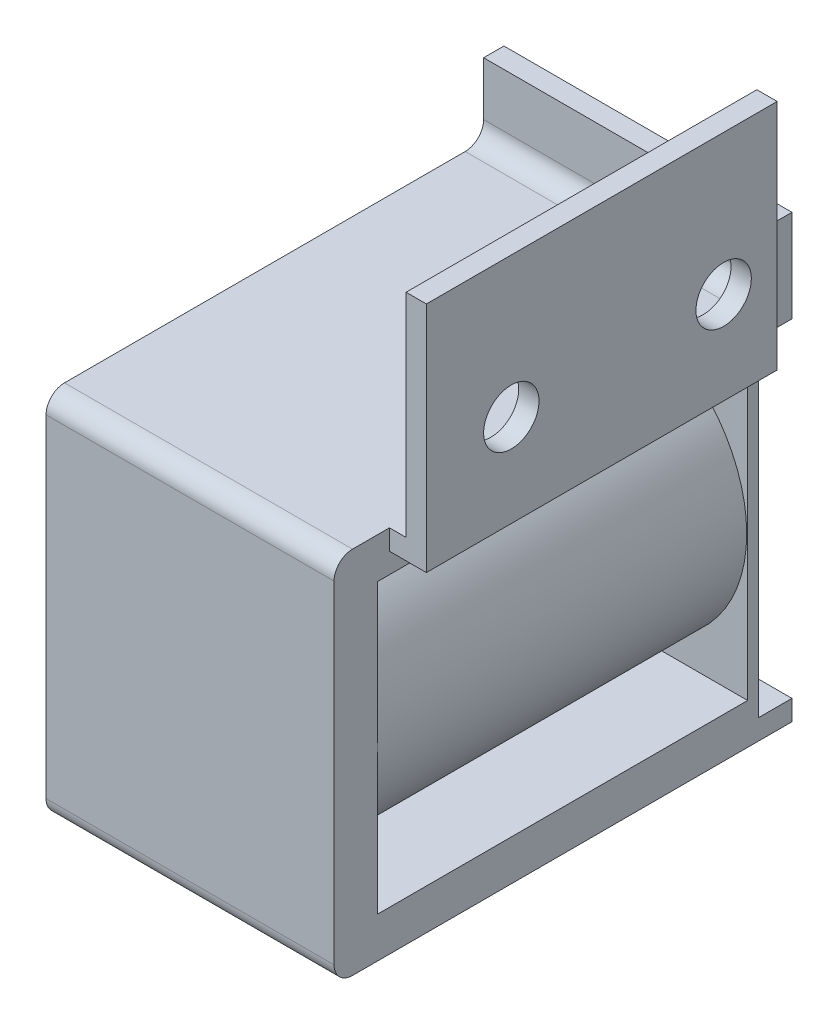
ISO-10303-21;
HEADER;
FILE_DESCRIPTION(('STEP AP214'),'2;1');
FILE_NAME('part.step','',(''),(''),'','','');
FILE_SCHEMA(('AUTOMOTIVE_DESIGN { 1 0 10303 214 1 1 1 1 }'));
ENDSEC;
DATA;
#1=APPLICATION_CONTEXT('core data for automotive mechanical design processes');
#2=APPLICATION_PROTOCOL_DEFINITION('international standard','automotive_design',2000,#1);
#3=PRODUCT_CONTEXT('',#1,'mechanical');
#4=PRODUCT('Part','Part','',(#3));
#5=PRODUCT_RELATED_PRODUCT_CATEGORY('part','',(#4));
#6=PRODUCT_DEFINITION_FORMATION('','',#4);
#7=PRODUCT_DEFINITION_CONTEXT('part definition',#1,'design');
#8=PRODUCT_DEFINITION('design','',#6,#7);
#9=PRODUCT_DEFINITION_SHAPE('','',#8);
#10=(LENGTH_UNIT() NAMED_UNIT(*) SI_UNIT(.MILLI.,.METRE.));
#11=(NAMED_UNIT(*) PLANE_ANGLE_UNIT() SI_UNIT($,.RADIAN.));
#12=(NAMED_UNIT(*) SI_UNIT($,.STERADIAN.) SOLID_ANGLE_UNIT());
#13=UNCERTAINTY_MEASURE_WITH_UNIT(LENGTH_MEASURE(1.E-05),#10,'distance_accuracy_value','');
#14=(GEOMETRIC_REPRESENTATION_CONTEXT(3) GLOBAL_UNCERTAINTY_ASSIGNED_CONTEXT((#13)) GLOBAL_UNIT_ASSIGNED_CONTEXT((#10,
#11,#12)) REPRESENTATION_CONTEXT('',''));
#15=CARTESIAN_POINT('',(0.,0.,0.));
#16=DIRECTION('',(0.,0.,1.));
#17=DIRECTION('',(1.,0.,0.));
#18=AXIS2_PLACEMENT_3D('',#15,#16,#17);
#19=CARTESIAN_POINT('',(0.,0.,0.));
#20=DIRECTION('',(0.,0.,1.));
#21=DIRECTION('',(1.,0.,0.));
#22=AXIS2_PLACEMENT_3D('',#19,#20,#21);
#23=PLANE('',#22);
#24=CARTESIAN_POINT('',(7.8,10.,0.));
#25=DIRECTION('',(0.,0.,1.));
#26=DIRECTION('',(0.,1.,0.));
#27=AXIS2_PLACEMENT_3D('',#24,#25,#26);
#28=CIRCLE('',#27,6.);
#29=CARTESIAN_POINT('',(7.8,16.,0.));
#30=VERTEX_POINT('',#29);
#31=EDGE_CURVE('E325',#30,#30,#28,.T.);
#32=ORIENTED_EDGE('',*,*,#31,.T.);
#33=EDGE_LOOP('',(#32));
#34=FACE_BOUND('',#33,.T.);
#35=DIRECTION('',(1.,0.,0.));
#36=VECTOR('',#35,1.);
#37=CARTESIAN_POINT('',(0.,1.1,0.));
#38=LINE('',#37,#36);
#39=CARTESIAN_POINT('',(0.,1.1,0.));
#40=VERTEX_POINT('',#39);
#41=CARTESIAN_POINT('',(15.6,1.1,0.));
#42=VERTEX_POINT('',#41);
#43=EDGE_CURVE('E222',#40,#42,#38,.T.);
#44=ORIENTED_EDGE('',*,*,#43,.F.);
#45=DIRECTION('',(0.,-1.,0.));
#46=VECTOR('',#45,1.);
#47=CARTESIAN_POINT('',(0.,20.,0.));
#48=LINE('',#47,#46);
#49=CARTESIAN_POINT('',(0.,18.9,0.));
#50=VERTEX_POINT('',#49);
#51=EDGE_CURVE('E340',#50,#40,#48,.T.);
#52=ORIENTED_EDGE('',*,*,#51,.F.);
#53=DIRECTION('',(1.,0.,0.));
#54=VECTOR('',#53,1.);
#55=CARTESIAN_POINT('',(-22.2101838133591,18.9,0.));
#56=LINE('',#55,#54);
#57=CARTESIAN_POINT('',(15.6,18.9,0.));
#58=VERTEX_POINT('',#57);
#59=EDGE_CURVE('E315',#50,#58,#56,.T.);
#60=ORIENTED_EDGE('',*,*,#59,.T.);
#61=DIRECTION('',(0.,1.,0.));
#62=VECTOR('',#61,1.);
#63=CARTESIAN_POINT('',(15.6,0.,0.));
#64=LINE('',#63,#62);
#65=EDGE_CURVE('E329',#42,#58,#64,.T.);
#66=ORIENTED_EDGE('',*,*,#65,.F.);
#67=EDGE_LOOP('',(#44,#52,#60,#66));
#68=FACE_BOUND('',#67,.T.);
#69=ADVANCED_FACE('F17',(#34,#68),#23,.F.);
#70=CARTESIAN_POINT('',(15.6,0.,23.));
#71=DIRECTION('',(-1.,0.,0.));
#72=DIRECTION('',(0.,0.,1.));
#73=AXIS2_PLACEMENT_3D('',#70,#71,#72);
#74=PLANE('',#73);
#75=DIRECTION('',(0.,0.,1.));
#76=VECTOR('',#75,1.);
#77=CARTESIAN_POINT('',(15.6,2.2,-21.8));
#78=LINE('',#77,#76);
#79=CARTESIAN_POINT('',(15.6,2.2,0.6));
#80=VERTEX_POINT('',#79);
#81=CARTESIAN_POINT('',(15.6,2.2,20.65));
#82=VERTEX_POINT('',#81);
#83=EDGE_CURVE('E206',#80,#82,#78,.T.);
#84=ORIENTED_EDGE('',*,*,#83,.T.);
#85=DIRECTION('',(0.,1.,0.));
#86=VECTOR('',#85,1.);
#87=CARTESIAN_POINT('',(15.6,2.2,20.65));
#88=LINE('',#87,#86);
#89=CARTESIAN_POINT('',(15.6,17.8,20.65));
#90=VERTEX_POINT('',#89);
#91=EDGE_CURVE('E196',#82,#90,#88,.T.);
#92=ORIENTED_EDGE('',*,*,#91,.T.);
#93=DIRECTION('',(0.,0.,1.));
#94=VECTOR('',#93,1.);
#95=CARTESIAN_POINT('',(15.6,17.8,-21.8));
#96=LINE('',#95,#94);
#97=CARTESIAN_POINT('',(15.6,17.8,0.6));
#98=VERTEX_POINT('',#97);
#99=EDGE_CURVE('E187',#98,#90,#96,.T.);
#100=ORIENTED_EDGE('',*,*,#99,.F.);
#101=DIRECTION('',(0.,-1.,0.));
#102=VECTOR('',#101,1.);
#103=CARTESIAN_POINT('',(15.6,2.2,0.6));
#104=LINE('',#103,#102);
#105=EDGE_CURVE('E172',#98,#80,#104,.T.);
#106=ORIENTED_EDGE('',*,*,#105,.T.);
#107=EDGE_LOOP('',(#84,#92,#100,#106));
#108=FACE_BOUND('',#107,.T.);
#109=DIRECTION('',(0.,1.,0.));
#110=VECTOR('',#109,1.);
#111=CARTESIAN_POINT('',(15.6,0.,23.));
#112=LINE('',#111,#110);
#113=CARTESIAN_POINT('',(15.6,1.,23.));
#114=VERTEX_POINT('',#113);
#115=CARTESIAN_POINT('',(15.6,19.,23.));
#116=VERTEX_POINT('',#115);
#117=EDGE_CURVE('E337',#114,#116,#112,.T.);
#118=ORIENTED_EDGE('',*,*,#117,.F.);
#119=CARTESIAN_POINT('',(15.6,1.,22.));
#120=DIRECTION('',(-1.,0.,0.));
#121=DIRECTION('',(0.,0.,1.));
#122=AXIS2_PLACEMENT_3D('',#119,#120,#121);
#123=CIRCLE('',#122,1.);
#124=CARTESIAN_POINT('',(15.6,0.,22.));
#125=VERTEX_POINT('',#124);
#126=EDGE_CURVE('E40',#114,#125,#123,.F.);
#127=ORIENTED_EDGE('',*,*,#126,.T.);
#128=DIRECTION('',(0.,0.,-1.));
#129=VECTOR('',#128,1.);
#130=CARTESIAN_POINT('',(15.6,0.,23.));
#131=LINE('',#130,#129);
#132=CARTESIAN_POINT('',(15.6,0.,-1.8));
#133=VERTEX_POINT('',#132);
#134=EDGE_CURVE('E336',#125,#133,#131,.T.);
#135=ORIENTED_EDGE('',*,*,#134,.T.);
#136=DIRECTION('',(0.,-1.,0.));
#137=VECTOR('',#136,1.);
#138=CARTESIAN_POINT('',(15.6,1.1,-1.8));
#139=LINE('',#138,#137);
#140=CARTESIAN_POINT('',(15.6,1.1,-1.8));
#141=VERTEX_POINT('',#140);
#142=EDGE_CURVE('E225',#141,#133,#139,.T.);
#143=ORIENTED_EDGE('',*,*,#142,.F.);
#144=DIRECTION('',(0.,0.,1.));
#145=VECTOR('',#144,1.);
#146=CARTESIAN_POINT('',(15.6,1.1,-1.8));
#147=LINE('',#146,#145);
#148=EDGE_CURVE('E232',#141,#42,#147,.T.);
#149=ORIENTED_EDGE('',*,*,#148,.T.);
#150=ORIENTED_EDGE('',*,*,#65,.T.);
#151=DIRECTION('',(0.,0.,1.));
#152=VECTOR('',#151,1.);
#153=CARTESIAN_POINT('',(15.6,18.9,0.));
#154=LINE('',#153,#152);
#155=CARTESIAN_POINT('',(15.6,18.9,-1.8));
#156=VERTEX_POINT('',#155);
#157=EDGE_CURVE('E312',#156,#58,#154,.T.);
#158=ORIENTED_EDGE('',*,*,#157,.F.);
#159=DIRECTION('',(0.,-1.,0.));
#160=VECTOR('',#159,1.);
#161=CARTESIAN_POINT('',(15.6,18.9,-1.8));
#162=LINE('',#161,#160);
#163=CARTESIAN_POINT('',(15.6,23.9,-1.8));
#164=VERTEX_POINT('',#163);
#165=EDGE_CURVE('E309',#164,#156,#162,.T.);
#166=ORIENTED_EDGE('',*,*,#165,.F.);
#167=DIRECTION('',(0.,0.,-1.));
#168=VECTOR('',#167,1.);
#169=CARTESIAN_POINT('',(15.6,23.9,-1.8));
#170=LINE('',#169,#168);
#171=CARTESIAN_POINT('',(15.6,23.9,-0.7));
#172=VERTEX_POINT('',#171);
#173=EDGE_CURVE('E306',#172,#164,#170,.T.);
#174=ORIENTED_EDGE('',*,*,#173,.F.);
#175=DIRECTION('',(0.,1.,0.));
#176=VECTOR('',#175,1.);
#177=CARTESIAN_POINT('',(15.6,23.9,-0.7));
#178=LINE('',#177,#176);
#179=CARTESIAN_POINT('',(15.6,21.,-0.7));
#180=VERTEX_POINT('',#179);
#181=EDGE_CURVE('E304',#180,#172,#178,.T.);
#182=ORIENTED_EDGE('',*,*,#181,.F.);
#183=CARTESIAN_POINT('',(15.6,21.,0.3));
#184=DIRECTION('',(-1.,0.,0.));
#185=DIRECTION('',(0.,0.,1.));
#186=AXIS2_PLACEMENT_3D('',#183,#184,#185);
#187=CIRCLE('',#186,1.);
#188=CARTESIAN_POINT('',(15.6,20.,0.3));
#189=VERTEX_POINT('',#188);
#190=EDGE_CURVE('E25',#180,#189,#187,.T.);
#191=ORIENTED_EDGE('',*,*,#190,.T.);
#192=DIRECTION('',(0.,0.,-1.));
#193=VECTOR('',#192,1.);
#194=CARTESIAN_POINT('',(15.6,20.,23.));
#195=LINE('',#194,#193);
#196=CARTESIAN_POINT('',(15.6,20.,1.));
#197=VERTEX_POINT('',#196);
#198=EDGE_CURVE('E352',#197,#189,#195,.T.);
#199=ORIENTED_EDGE('',*,*,#198,.F.);
#200=DIRECTION('',(0.,-1.,0.));
#201=VECTOR('',#200,1.);
#202=CARTESIAN_POINT('',(15.6,20.,1.));
#203=LINE('',#202,#201);
#204=CARTESIAN_POINT('',(15.6,18.9,1.));
#205=VERTEX_POINT('',#204);
#206=EDGE_CURVE('E263',#197,#205,#203,.T.);
#207=ORIENTED_EDGE('',*,*,#206,.T.);
#208=DIRECTION('',(0.,0.,1.));
#209=VECTOR('',#208,1.);
#210=CARTESIAN_POINT('',(15.6,18.9,1.));
#211=LINE('',#210,#209);
#212=CARTESIAN_POINT('',(15.6,18.9,20.));
#213=VERTEX_POINT('',#212);
#214=EDGE_CURVE('E274',#205,#213,#211,.T.);
#215=ORIENTED_EDGE('',*,*,#214,.T.);
#216=DIRECTION('',(0.,1.,0.));
#217=VECTOR('',#216,1.);
#218=CARTESIAN_POINT('',(15.6,18.9,20.));
#219=LINE('',#218,#217);
#220=CARTESIAN_POINT('',(15.6,20.,20.));
#221=VERTEX_POINT('',#220);
#222=EDGE_CURVE('E273',#213,#221,#219,.T.);
#223=ORIENTED_EDGE('',*,*,#222,.T.);
#224=CARTESIAN_POINT('',(15.6,20.,22.));
#225=VERTEX_POINT('',#224);
#226=EDGE_CURVE('E353',#225,#221,#195,.T.);
#227=ORIENTED_EDGE('',*,*,#226,.F.);
#228=CARTESIAN_POINT('',(15.6,19.,22.));
#229=DIRECTION('',(-1.,0.,0.));
#230=DIRECTION('',(0.,0.,1.));
#231=AXIS2_PLACEMENT_3D('',#228,#229,#230);
#232=CIRCLE('',#231,1.);
#233=EDGE_CURVE('E368',#225,#116,#232,.F.);
#234=ORIENTED_EDGE('',*,*,#233,.T.);
#235=EDGE_LOOP('',(#118,#127,#135,#143,#149,#150,#158,#166,#174,#182,#191,#199,#207,#215,#223,
#227,#234));
#236=FACE_BOUND('',#235,.T.);
#237=ADVANCED_FACE('F195',(#108,#236),#74,.F.);
#238=CARTESIAN_POINT('',(15.6,20.,23.));
#239=DIRECTION('',(0.,-1.,0.));
#240=DIRECTION('',(1.,0.,0.));
#241=AXIS2_PLACEMENT_3D('',#238,#239,#240);
#242=PLANE('',#241);
#243=ORIENTED_EDGE('',*,*,#198,.T.);
#244=DIRECTION('',(1.,0.,0.));
#245=VECTOR('',#244,1.);
#246=CARTESIAN_POINT('',(15.6,20.,0.3));
#247=LINE('',#246,#245);
#248=CARTESIAN_POINT('',(0.,20.,0.3));
#249=VERTEX_POINT('',#248);
#250=EDGE_CURVE('E360',#189,#249,#247,.F.);
#251=ORIENTED_EDGE('',*,*,#250,.T.);
#252=DIRECTION('',(0.,0.,-1.));
#253=VECTOR('',#252,1.);
#254=CARTESIAN_POINT('',(0.,20.,23.));
#255=LINE('',#254,#253);
#256=CARTESIAN_POINT('',(0.,20.,22.));
#257=VERTEX_POINT('',#256);
#258=EDGE_CURVE('E349',#257,#249,#255,.T.);
#259=ORIENTED_EDGE('',*,*,#258,.F.);
#260=DIRECTION('',(-1.,0.,0.));
#261=VECTOR('',#260,1.);
#262=CARTESIAN_POINT('',(15.6,20.,22.));
#263=LINE('',#262,#261);
#264=EDGE_CURVE('E358',#257,#225,#263,.F.);
#265=ORIENTED_EDGE('',*,*,#264,.T.);
#266=ORIENTED_EDGE('',*,*,#226,.T.);
#267=DIRECTION('',(-1.,0.,0.));
#268=VECTOR('',#267,1.);
#269=CARTESIAN_POINT('',(17.6,20.,20.));
#270=LINE('',#269,#268);
#271=CARTESIAN_POINT('',(16.5,20.,20.));
#272=VERTEX_POINT('',#271);
#273=EDGE_CURVE('E285',#272,#221,#270,.T.);
#274=ORIENTED_EDGE('',*,*,#273,.F.);
#275=DIRECTION('',(0.,0.,-1.));
#276=VECTOR('',#275,1.);
#277=CARTESIAN_POINT('',(16.5,20.,20.));
#278=LINE('',#277,#276);
#279=CARTESIAN_POINT('',(16.5,20.,1.));
#280=VERTEX_POINT('',#279);
#281=EDGE_CURVE('E243',#272,#280,#278,.T.);
#282=ORIENTED_EDGE('',*,*,#281,.T.);
#283=DIRECTION('',(-1.,0.,0.));
#284=VECTOR('',#283,1.);
#285=CARTESIAN_POINT('',(17.6,20.,1.));
#286=LINE('',#285,#284);
#287=EDGE_CURVE('E270',#280,#197,#286,.T.);
#288=ORIENTED_EDGE('',*,*,#287,.T.);
#289=EDGE_LOOP('',(#243,#251,#259,#265,#266,#274,#282,#288));
#290=FACE_BOUND('',#289,.T.);
#291=ADVANCED_FACE('F383',(#290),#242,.F.);
#292=CARTESIAN_POINT('',(0.,20.,23.));
#293=DIRECTION('',(1.,0.,0.));
#294=DIRECTION('',(0.,1.,0.));
#295=AXIS2_PLACEMENT_3D('',#292,#293,#294);
#296=PLANE('',#295);
#297=DIRECTION('',(0.,0.,1.));
#298=VECTOR('',#297,1.);
#299=CARTESIAN_POINT('',(0.,17.8,-21.8));
#300=LINE('',#299,#298);
#301=CARTESIAN_POINT('',(0.,17.8,0.6));
#302=VERTEX_POINT('',#301);
#303=CARTESIAN_POINT('',(0.,17.8,20.65));
#304=VERTEX_POINT('',#303);
#305=EDGE_CURVE('E190',#302,#304,#300,.T.);
#306=ORIENTED_EDGE('',*,*,#305,.T.);
#307=DIRECTION('',(0.,-1.,0.));
#308=VECTOR('',#307,1.);
#309=CARTESIAN_POINT('',(0.,17.8,20.65));
#310=LINE('',#309,#308);
#311=CARTESIAN_POINT('',(0.,2.2,20.65));
#312=VERTEX_POINT('',#311);
#313=EDGE_CURVE('E1189',#304,#312,#310,.T.);
#314=ORIENTED_EDGE('',*,*,#313,.T.);
#315=DIRECTION('',(0.,0.,1.));
#316=VECTOR('',#315,1.);
#317=CARTESIAN_POINT('',(0.,2.2,-21.8));
#318=LINE('',#317,#316);
#319=CARTESIAN_POINT('',(0.,2.2,0.6));
#320=VERTEX_POINT('',#319);
#321=EDGE_CURVE('E199',#320,#312,#318,.T.);
#322=ORIENTED_EDGE('',*,*,#321,.F.);
#323=DIRECTION('',(0.,1.,0.));
#324=VECTOR('',#323,1.);
#325=CARTESIAN_POINT('',(0.,17.8,0.6));
#326=LINE('',#325,#324);
#327=EDGE_CURVE('E1186',#320,#302,#326,.T.);
#328=ORIENTED_EDGE('',*,*,#327,.T.);
#329=EDGE_LOOP('',(#306,#314,#322,#328));
#330=FACE_BOUND('',#329,.T.);
#331=DIRECTION('',(0.,0.,-1.));
#332=VECTOR('',#331,1.);
#333=CARTESIAN_POINT('',(0.,0.,23.));
#334=LINE('',#333,#332);
#335=CARTESIAN_POINT('',(0.,0.,22.));
#336=VERTEX_POINT('',#335);
#337=CARTESIAN_POINT('',(0.,0.,-1.8));
#338=VERTEX_POINT('',#337);
#339=EDGE_CURVE('E347',#336,#338,#334,.T.);
#340=ORIENTED_EDGE('',*,*,#339,.F.);
#341=CARTESIAN_POINT('',(0.,1.,22.));
#342=DIRECTION('',(1.,0.,0.));
#343=DIRECTION('',(0.,1.,0.));
#344=AXIS2_PLACEMENT_3D('',#341,#342,#343);
#345=CIRCLE('',#344,1.);
#346=CARTESIAN_POINT('',(0.,1.,23.));
#347=VERTEX_POINT('',#346);
#348=EDGE_CURVE('E374',#336,#347,#345,.F.);
#349=ORIENTED_EDGE('',*,*,#348,.T.);
#350=DIRECTION('',(0.,-1.,0.));
#351=VECTOR('',#350,1.);
#352=CARTESIAN_POINT('',(0.,20.,23.));
#353=LINE('',#352,#351);
#354=CARTESIAN_POINT('',(0.,19.,23.));
#355=VERTEX_POINT('',#354);
#356=EDGE_CURVE('E333',#355,#347,#353,.T.);
#357=ORIENTED_EDGE('',*,*,#356,.F.);
#358=CARTESIAN_POINT('',(0.,19.,22.));
#359=DIRECTION('',(1.,0.,0.));
#360=DIRECTION('',(0.,1.,0.));
#361=AXIS2_PLACEMENT_3D('',#358,#359,#360);
#362=CIRCLE('',#361,1.);
#363=EDGE_CURVE('E372',#355,#257,#362,.F.);
#364=ORIENTED_EDGE('',*,*,#363,.T.);
#365=ORIENTED_EDGE('',*,*,#258,.T.);
#366=CARTESIAN_POINT('',(0.,21.,0.3));
#367=DIRECTION('',(1.,0.,0.));
#368=DIRECTION('',(0.,1.,0.));
#369=AXIS2_PLACEMENT_3D('',#366,#367,#368);
#370=CIRCLE('',#369,1.);
#371=CARTESIAN_POINT('',(0.,21.,-0.7));
#372=VERTEX_POINT('',#371);
#373=EDGE_CURVE('E11',#249,#372,#370,.T.);
#374=ORIENTED_EDGE('',*,*,#373,.T.);
#375=DIRECTION('',(0.,-1.,0.));
#376=VECTOR('',#375,1.);
#377=CARTESIAN_POINT('',(0.,23.9,-0.7));
#378=LINE('',#377,#376);
#379=CARTESIAN_POINT('',(0.,23.9,-0.7));
#380=VERTEX_POINT('',#379);
#381=EDGE_CURVE('E292',#380,#372,#378,.T.);
#382=ORIENTED_EDGE('',*,*,#381,.F.);
#383=DIRECTION('',(0.,0.,1.));
#384=VECTOR('',#383,1.);
#385=CARTESIAN_POINT('',(0.,23.9,-1.8));
#386=LINE('',#385,#384);
#387=CARTESIAN_POINT('',(0.,23.9,-1.8));
#388=VERTEX_POINT('',#387);
#389=EDGE_CURVE('E295',#388,#380,#386,.T.);
#390=ORIENTED_EDGE('',*,*,#389,.F.);
#391=DIRECTION('',(0.,1.,0.));
#392=VECTOR('',#391,1.);
#393=CARTESIAN_POINT('',(0.,18.9,-1.8));
#394=LINE('',#393,#392);
#395=CARTESIAN_POINT('',(0.,18.9,-1.8));
#396=VERTEX_POINT('',#395);
#397=EDGE_CURVE('E298',#396,#388,#394,.T.);
#398=ORIENTED_EDGE('',*,*,#397,.F.);
#399=DIRECTION('',(0.,0.,-1.));
#400=VECTOR('',#399,1.);
#401=CARTESIAN_POINT('',(0.,18.9,0.));
#402=LINE('',#401,#400);
#403=EDGE_CURVE('E301',#50,#396,#402,.T.);
#404=ORIENTED_EDGE('',*,*,#403,.F.);
#405=ORIENTED_EDGE('',*,*,#51,.T.);
#406=DIRECTION('',(0.,0.,1.));
#407=VECTOR('',#406,1.);
#408=CARTESIAN_POINT('',(0.,1.1,-1.8));
#409=LINE('',#408,#407);
#410=CARTESIAN_POINT('',(0.,1.1,-1.8));
#411=VERTEX_POINT('',#410);
#412=EDGE_CURVE('E240',#411,#40,#409,.T.);
#413=ORIENTED_EDGE('',*,*,#412,.F.);
#414=DIRECTION('',(0.,1.,0.));
#415=VECTOR('',#414,1.);
#416=CARTESIAN_POINT('',(0.,0.,-1.8));
#417=LINE('',#416,#415);
#418=EDGE_CURVE('E226',#338,#411,#417,.T.);
#419=ORIENTED_EDGE('',*,*,#418,.F.);
#420=EDGE_LOOP('',(#340,#349,#357,#364,#365,#374,#382,#390,#398,#404,#405,#413,#419));
#421=FACE_BOUND('',#420,.T.);
#422=ADVANCED_FACE('F390',(#330,#421),#296,.F.);
#423=CARTESIAN_POINT('',(0.,0.,23.));
#424=DIRECTION('',(0.,1.,0.));
#425=DIRECTION('',(0.,0.,1.));
#426=AXIS2_PLACEMENT_3D('',#423,#424,#425);
#427=PLANE('',#426);
#428=ORIENTED_EDGE('',*,*,#134,.F.);
#429=DIRECTION('',(1.,0.,0.));
#430=VECTOR('',#429,1.);
#431=CARTESIAN_POINT('',(0.,0.,22.));
#432=LINE('',#431,#430);
#433=EDGE_CURVE('E32',#125,#336,#432,.F.);
#434=ORIENTED_EDGE('',*,*,#433,.T.);
#435=ORIENTED_EDGE('',*,*,#339,.T.);
#436=DIRECTION('',(-1.,0.,0.));
#437=VECTOR('',#436,1.);
#438=CARTESIAN_POINT('',(15.6,0.,-1.8));
#439=LINE('',#438,#437);
#440=EDGE_CURVE('E229',#133,#338,#439,.T.);
#441=ORIENTED_EDGE('',*,*,#440,.F.);
#442=EDGE_LOOP('',(#428,#434,#435,#441));
#443=FACE_BOUND('',#442,.T.);
#444=ADVANCED_FACE('F472',(#443),#427,.F.);
#445=CARTESIAN_POINT('',(0.,0.,23.));
#446=DIRECTION('',(0.,0.,1.));
#447=DIRECTION('',(1.,0.,0.));
#448=AXIS2_PLACEMENT_3D('',#445,#446,#447);
#449=PLANE('',#448);
#450=ORIENTED_EDGE('',*,*,#356,.T.);
#451=DIRECTION('',(1.,0.,0.));
#452=VECTOR('',#451,1.);
#453=CARTESIAN_POINT('',(15.6,1.,23.));
#454=LINE('',#453,#452);
#455=EDGE_CURVE('E365',#347,#114,#454,.T.);
#456=ORIENTED_EDGE('',*,*,#455,.T.);
#457=ORIENTED_EDGE('',*,*,#117,.T.);
#458=DIRECTION('',(-1.,0.,0.));
#459=VECTOR('',#458,1.);
#460=CARTESIAN_POINT('',(0.,19.,23.));
#461=LINE('',#460,#459);
#462=EDGE_CURVE('E362',#116,#355,#461,.T.);
#463=ORIENTED_EDGE('',*,*,#462,.T.);
#464=EDGE_LOOP('',(#450,#456,#457,#463));
#465=FACE_BOUND('',#464,.T.);
#466=ADVANCED_FACE('F422',(#465),#449,.T.);
#467=CARTESIAN_POINT('',(7.8,10.,-1.7));
#468=DIRECTION('',(0.,0.,1.));
#469=DIRECTION('',(1.,0.,0.));
#470=AXIS2_PLACEMENT_3D('',#467,#468,#469);
#471=CYLINDRICAL_SURFACE('',#470,6.);
#472=CARTESIAN_POINT('',(7.8,10.,-1.7));
#473=DIRECTION('',(0.,0.,1.));
#474=DIRECTION('',(0.,1.,0.));
#475=AXIS2_PLACEMENT_3D('',#472,#473,#474);
#476=CIRCLE('',#475,6.);
#477=CARTESIAN_POINT('',(7.8,16.,-1.7));
#478=VERTEX_POINT('',#477);
#479=EDGE_CURVE('E326',#478,#478,#476,.T.);
#480=ORIENTED_EDGE('',*,*,#479,.T.);
#481=EDGE_LOOP('',(#480));
#482=FACE_BOUND('',#481,.T.);
#483=ORIENTED_EDGE('',*,*,#31,.F.);
#484=EDGE_LOOP('',(#483));
#485=FACE_BOUND('',#484,.T.);
#486=ADVANCED_FACE('F674',(#482,#485),#471,.T.);
#487=CARTESIAN_POINT('',(7.8,10.,-1.7));
#488=DIRECTION('',(0.,0.,1.));
#489=DIRECTION('',(1.,0.,0.));
#490=AXIS2_PLACEMENT_3D('',#487,#488,#489);
#491=PLANE('',#490);
#492=ORIENTED_EDGE('',*,*,#479,.F.);
#493=EDGE_LOOP('',(#492));
#494=FACE_BOUND('',#493,.T.);
#495=ADVANCED_FACE('F664',(#494),#491,.F.);
#496=CARTESIAN_POINT('',(-22.2101838133591,18.9,0.));
#497=DIRECTION('',(0.,-1.,0.));
#498=DIRECTION('',(0.,0.,-1.));
#499=AXIS2_PLACEMENT_3D('',#496,#497,#498);
#500=PLANE('',#499);
#501=ORIENTED_EDGE('',*,*,#59,.F.);
#502=ORIENTED_EDGE('',*,*,#403,.T.);
#503=DIRECTION('',(1.,0.,0.));
#504=VECTOR('',#503,1.);
#505=CARTESIAN_POINT('',(-22.2101838133591,18.9,-1.8));
#506=LINE('',#505,#504);
#507=EDGE_CURVE('E323',#396,#156,#506,.T.);
#508=ORIENTED_EDGE('',*,*,#507,.T.);
#509=ORIENTED_EDGE('',*,*,#157,.T.);
#510=EDGE_LOOP('',(#501,#502,#508,#509));
#511=FACE_BOUND('',#510,.T.);
#512=ADVANCED_FACE('F404',(#511),#500,.T.);
#513=CARTESIAN_POINT('',(-22.2101838133591,18.9,-1.8));
#514=DIRECTION('',(0.,0.,-1.));
#515=DIRECTION('',(-1.,0.,0.));
#516=AXIS2_PLACEMENT_3D('',#513,#514,#515);
#517=PLANE('',#516);
#518=ORIENTED_EDGE('',*,*,#507,.F.);
#519=ORIENTED_EDGE('',*,*,#397,.T.);
#520=DIRECTION('',(1.,0.,0.));
#521=VECTOR('',#520,1.);
#522=CARTESIAN_POINT('',(-22.2101838133591,23.9,-1.8));
#523=LINE('',#522,#521);
#524=EDGE_CURVE('E321',#388,#164,#523,.T.);
#525=ORIENTED_EDGE('',*,*,#524,.T.);
#526=ORIENTED_EDGE('',*,*,#165,.T.);
#527=EDGE_LOOP('',(#518,#519,#525,#526));
#528=FACE_BOUND('',#527,.T.);
#529=ADVANCED_FACE('F401',(#528),#517,.T.);
#530=CARTESIAN_POINT('',(-22.2101838133591,23.9,-1.8));
#531=DIRECTION('',(0.,1.,0.));
#532=DIRECTION('',(0.,0.,1.));
#533=AXIS2_PLACEMENT_3D('',#530,#531,#532);
#534=PLANE('',#533);
#535=ORIENTED_EDGE('',*,*,#524,.F.);
#536=ORIENTED_EDGE('',*,*,#389,.T.);
#537=DIRECTION('',(1.,0.,0.));
#538=VECTOR('',#537,1.);
#539=CARTESIAN_POINT('',(-22.2101838133591,23.9,-0.7));
#540=LINE('',#539,#538);
#541=EDGE_CURVE('E318',#380,#172,#540,.T.);
#542=ORIENTED_EDGE('',*,*,#541,.T.);
#543=ORIENTED_EDGE('',*,*,#173,.T.);
#544=EDGE_LOOP('',(#535,#536,#542,#543));
#545=FACE_BOUND('',#544,.T.);
#546=ADVANCED_FACE('F396',(#545),#534,.T.);
#547=CARTESIAN_POINT('',(-22.2101838133591,23.9,-0.7));
#548=DIRECTION('',(0.,0.,1.));
#549=DIRECTION('',(1.,0.,0.));
#550=AXIS2_PLACEMENT_3D('',#547,#548,#549);
#551=PLANE('',#550);
#552=ORIENTED_EDGE('',*,*,#381,.T.);
#553=DIRECTION('',(1.,0.,0.));
#554=VECTOR('',#553,1.);
#555=CARTESIAN_POINT('',(-22.2101838133591,21.,-0.7));
#556=LINE('',#555,#554);
#557=EDGE_CURVE('E355',#372,#180,#556,.T.);
#558=ORIENTED_EDGE('',*,*,#557,.T.);
#559=ORIENTED_EDGE('',*,*,#181,.T.);
#560=ORIENTED_EDGE('',*,*,#541,.F.);
#561=EDGE_LOOP('',(#552,#558,#559,#560));
#562=FACE_BOUND('',#561,.T.);
#563=ADVANCED_FACE('F393',(#562),#551,.T.);
#564=CARTESIAN_POINT('',(17.6,20.,1.));
#565=DIRECTION('',(0.,0.,-1.));
#566=DIRECTION('',(0.,1.,0.));
#567=AXIS2_PLACEMENT_3D('',#564,#565,#566);
#568=PLANE('',#567);
#569=ORIENTED_EDGE('',*,*,#206,.F.);
#570=ORIENTED_EDGE('',*,*,#287,.F.);
#571=DIRECTION('',(0.,-1.,0.));
#572=VECTOR('',#571,1.);
#573=CARTESIAN_POINT('',(16.5,31.5,1.));
#574=LINE('',#573,#572);
#575=CARTESIAN_POINT('',(16.5,31.5,1.));
#576=VERTEX_POINT('',#575);
#577=EDGE_CURVE('E254',#576,#280,#574,.T.);
#578=ORIENTED_EDGE('',*,*,#577,.F.);
#579=DIRECTION('',(1.,0.,0.));
#580=VECTOR('',#579,1.);
#581=CARTESIAN_POINT('',(16.5,31.5,1.));
#582=LINE('',#581,#580);
#583=CARTESIAN_POINT('',(17.6,31.5,1.));
#584=VERTEX_POINT('',#583);
#585=EDGE_CURVE('E247',#576,#584,#582,.T.);
#586=ORIENTED_EDGE('',*,*,#585,.T.);
#587=DIRECTION('',(0.,-1.,0.));
#588=VECTOR('',#587,1.);
#589=CARTESIAN_POINT('',(17.6,20.,1.));
#590=LINE('',#589,#588);
#591=CARTESIAN_POINT('',(17.6,18.9,1.));
#592=VERTEX_POINT('',#591);
#593=EDGE_CURVE('E268',#584,#592,#590,.T.);
#594=ORIENTED_EDGE('',*,*,#593,.T.);
#595=DIRECTION('',(-1.,0.,0.));
#596=VECTOR('',#595,1.);
#597=CARTESIAN_POINT('',(17.6,18.9,1.));
#598=LINE('',#597,#596);
#599=EDGE_CURVE('E290',#592,#205,#598,.T.);
#600=ORIENTED_EDGE('',*,*,#599,.T.);
#601=EDGE_LOOP('',(#569,#570,#578,#586,#594,#600));
#602=FACE_BOUND('',#601,.T.);
#603=ADVANCED_FACE('F449',(#602),#568,.T.);
#604=CARTESIAN_POINT('',(17.6,18.9,1.));
#605=DIRECTION('',(0.,-1.,0.));
#606=DIRECTION('',(0.,0.,-1.));
#607=AXIS2_PLACEMENT_3D('',#604,#605,#606);
#608=PLANE('',#607);
#609=ORIENTED_EDGE('',*,*,#214,.F.);
#610=ORIENTED_EDGE('',*,*,#599,.F.);
#611=DIRECTION('',(0.,0.,1.));
#612=VECTOR('',#611,1.);
#613=CARTESIAN_POINT('',(17.6,18.9,1.));
#614=LINE('',#613,#612);
#615=CARTESIAN_POINT('',(17.6,18.9,20.));
#616=VERTEX_POINT('',#615);
#617=EDGE_CURVE('E264',#592,#616,#614,.T.);
#618=ORIENTED_EDGE('',*,*,#617,.T.);
#619=DIRECTION('',(-1.,0.,0.));
#620=VECTOR('',#619,1.);
#621=CARTESIAN_POINT('',(17.6,18.9,20.));
#622=LINE('',#621,#620);
#623=EDGE_CURVE('E288',#616,#213,#622,.T.);
#624=ORIENTED_EDGE('',*,*,#623,.T.);
#625=EDGE_LOOP('',(#609,#610,#618,#624));
#626=FACE_BOUND('',#625,.T.);
#627=ADVANCED_FACE('F435',(#626),#608,.T.);
#628=CARTESIAN_POINT('',(17.6,18.9,20.));
#629=DIRECTION('',(0.,0.,1.));
#630=DIRECTION('',(1.,0.,0.));
#631=AXIS2_PLACEMENT_3D('',#628,#629,#630);
#632=PLANE('',#631);
#633=ORIENTED_EDGE('',*,*,#222,.F.);
#634=ORIENTED_EDGE('',*,*,#623,.F.);
#635=DIRECTION('',(0.,1.,0.));
#636=VECTOR('',#635,1.);
#637=CARTESIAN_POINT('',(17.6,18.9,20.));
#638=LINE('',#637,#636);
#639=CARTESIAN_POINT('',(17.6,31.5,20.));
#640=VERTEX_POINT('',#639);
#641=EDGE_CURVE('E267',#616,#640,#638,.T.);
#642=ORIENTED_EDGE('',*,*,#641,.T.);
#643=DIRECTION('',(-1.,0.,0.));
#644=VECTOR('',#643,1.);
#645=CARTESIAN_POINT('',(17.6,31.5,20.));
#646=LINE('',#645,#644);
#647=CARTESIAN_POINT('',(16.5,31.5,20.));
#648=VERTEX_POINT('',#647);
#649=EDGE_CURVE('E248',#640,#648,#646,.T.);
#650=ORIENTED_EDGE('',*,*,#649,.T.);
#651=DIRECTION('',(0.,-1.,0.));
#652=VECTOR('',#651,1.);
#653=CARTESIAN_POINT('',(16.5,31.5,20.));
#654=LINE('',#653,#652);
#655=EDGE_CURVE('E261',#648,#272,#654,.T.);
#656=ORIENTED_EDGE('',*,*,#655,.T.);
#657=ORIENTED_EDGE('',*,*,#273,.T.);
#658=EDGE_LOOP('',(#633,#634,#642,#650,#656,#657));
#659=FACE_BOUND('',#658,.T.);
#660=ADVANCED_FACE('F431',(#659),#632,.T.);
#661=CARTESIAN_POINT('',(17.6,0.,0.));
#662=DIRECTION('',(-1.,0.,0.));
#663=DIRECTION('',(0.,0.,1.));
#664=AXIS2_PLACEMENT_3D('',#661,#662,#663);
#665=PLANE('',#664);
#666=CARTESIAN_POINT('',(17.6,23.9,3.9));
#667=DIRECTION('',(-1.,0.,0.));
#668=DIRECTION('',(0.,1.,0.));
#669=AXIS2_PLACEMENT_3D('',#666,#667,#668);
#670=CIRCLE('',#669,1.5);
#671=CARTESIAN_POINT('',(17.6,25.4,3.9));
#672=VERTEX_POINT('',#671);
#673=EDGE_CURVE('E191',#672,#672,#670,.T.);
#674=ORIENTED_EDGE('',*,*,#673,.T.);
#675=EDGE_LOOP('',(#674));
#676=FACE_BOUND('',#675,.T.);
#677=CARTESIAN_POINT('',(17.6,23.9,15.4));
#678=DIRECTION('',(-1.,0.,0.));
#679=DIRECTION('',(0.,1.,0.));
#680=AXIS2_PLACEMENT_3D('',#677,#678,#679);
#681=CIRCLE('',#680,1.5);
#682=CARTESIAN_POINT('',(17.6,25.4,15.4));
#683=VERTEX_POINT('',#682);
#684=EDGE_CURVE('E215',#683,#683,#681,.T.);
#685=ORIENTED_EDGE('',*,*,#684,.T.);
#686=EDGE_LOOP('',(#685));
#687=FACE_BOUND('',#686,.T.);
#688=ORIENTED_EDGE('',*,*,#593,.F.);
#689=DIRECTION('',(0.,0.,1.));
#690=VECTOR('',#689,1.);
#691=CARTESIAN_POINT('',(17.6,31.5,1.));
#692=LINE('',#691,#690);
#693=EDGE_CURVE('E251',#584,#640,#692,.T.);
#694=ORIENTED_EDGE('',*,*,#693,.T.);
#695=ORIENTED_EDGE('',*,*,#641,.F.);
#696=ORIENTED_EDGE('',*,*,#617,.F.);
#697=EDGE_LOOP('',(#688,#694,#695,#696));
#698=FACE_BOUND('',#697,.T.);
#699=ADVANCED_FACE('F441',(#676,#687,#698),#665,.F.);
#700=CARTESIAN_POINT('',(16.5,31.5,20.));
#701=DIRECTION('',(-1.,0.,0.));
#702=DIRECTION('',(0.,-1.,0.));
#703=AXIS2_PLACEMENT_3D('',#700,#701,#702);
#704=PLANE('',#703);
#705=CARTESIAN_POINT('',(16.5,23.9,3.9));
#706=DIRECTION('',(-1.,0.,0.));
#707=DIRECTION('',(0.,-1.,0.));
#708=AXIS2_PLACEMENT_3D('',#705,#706,#707);
#709=CIRCLE('',#708,1.5);
#710=CARTESIAN_POINT('',(16.5,22.4,3.9));
#711=VERTEX_POINT('',#710);
#712=EDGE_CURVE('E212',#711,#711,#709,.F.);
#713=ORIENTED_EDGE('',*,*,#712,.T.);
#714=EDGE_LOOP('',(#713));
#715=FACE_BOUND('',#714,.T.);
#716=CARTESIAN_POINT('',(16.5,23.9,15.4));
#717=DIRECTION('',(-1.,0.,0.));
#718=DIRECTION('',(0.,-1.,0.));
#719=AXIS2_PLACEMENT_3D('',#716,#717,#718);
#720=CIRCLE('',#719,1.5);
#721=CARTESIAN_POINT('',(16.5,22.4,15.4));
#722=VERTEX_POINT('',#721);
#723=EDGE_CURVE('E219',#722,#722,#720,.F.);
#724=ORIENTED_EDGE('',*,*,#723,.T.);
#725=EDGE_LOOP('',(#724));
#726=FACE_BOUND('',#725,.T.);
#727=ORIENTED_EDGE('',*,*,#281,.F.);
#728=ORIENTED_EDGE('',*,*,#655,.F.);
#729=DIRECTION('',(0.,0.,-1.));
#730=VECTOR('',#729,1.);
#731=CARTESIAN_POINT('',(16.5,31.5,20.));
#732=LINE('',#731,#730);
#733=EDGE_CURVE('E244',#648,#576,#732,.T.);
#734=ORIENTED_EDGE('',*,*,#733,.T.);
#735=ORIENTED_EDGE('',*,*,#577,.T.);
#736=EDGE_LOOP('',(#727,#728,#734,#735));
#737=FACE_BOUND('',#736,.T.);
#738=ADVANCED_FACE('F447',(#715,#726,#737),#704,.T.);
#739=CARTESIAN_POINT('',(0.,31.5,0.));
#740=DIRECTION('',(0.,-1.,0.));
#741=DIRECTION('',(1.,0.,0.));
#742=AXIS2_PLACEMENT_3D('',#739,#740,#741);
#743=PLANE('',#742);
#744=ORIENTED_EDGE('',*,*,#649,.F.);
#745=ORIENTED_EDGE('',*,*,#693,.F.);
#746=ORIENTED_EDGE('',*,*,#585,.F.);
#747=ORIENTED_EDGE('',*,*,#733,.F.);
#748=EDGE_LOOP('',(#744,#745,#746,#747));
#749=FACE_BOUND('',#748,.T.);
#750=ADVANCED_FACE('F445',(#749),#743,.F.);
#751=CARTESIAN_POINT('',(0.,1.1,-1.8));
#752=DIRECTION('',(0.,-1.,0.));
#753=DIRECTION('',(0.,0.,-1.));
#754=AXIS2_PLACEMENT_3D('',#751,#752,#753);
#755=PLANE('',#754);
#756=ORIENTED_EDGE('',*,*,#43,.T.);
#757=ORIENTED_EDGE('',*,*,#148,.F.);
#758=DIRECTION('',(1.,0.,0.));
#759=VECTOR('',#758,1.);
#760=CARTESIAN_POINT('',(0.,1.1,-1.8));
#761=LINE('',#760,#759);
#762=EDGE_CURVE('E223',#411,#141,#761,.T.);
#763=ORIENTED_EDGE('',*,*,#762,.F.);
#764=ORIENTED_EDGE('',*,*,#412,.T.);
#765=EDGE_LOOP('',(#756,#757,#763,#764));
#766=FACE_BOUND('',#765,.T.);
#767=ADVANCED_FACE('F410',(#766),#755,.F.);
#768=CARTESIAN_POINT('',(0.,0.,-1.8));
#769=DIRECTION('',(0.,0.,-1.));
#770=DIRECTION('',(-1.,0.,0.));
#771=AXIS2_PLACEMENT_3D('',#768,#769,#770);
#772=PLANE('',#771);
#773=ORIENTED_EDGE('',*,*,#418,.T.);
#774=ORIENTED_EDGE('',*,*,#762,.T.);
#775=ORIENTED_EDGE('',*,*,#142,.T.);
#776=ORIENTED_EDGE('',*,*,#440,.T.);
#777=EDGE_LOOP('',(#773,#774,#775,#776));
#778=FACE_BOUND('',#777,.T.);
#779=ADVANCED_FACE('F414',(#778),#772,.T.);
#780=CARTESIAN_POINT('',(-26.1841295448477,23.9,15.4));
#781=DIRECTION('',(1.,0.,0.));
#782=DIRECTION('',(0.,0.,-1.));
#783=AXIS2_PLACEMENT_3D('',#780,#781,#782);
#784=CYLINDRICAL_SURFACE('',#783,1.5);
#785=ORIENTED_EDGE('',*,*,#684,.F.);
#786=EDGE_LOOP('',(#785));
#787=FACE_BOUND('',#786,.T.);
#788=ORIENTED_EDGE('',*,*,#723,.F.);
#789=EDGE_LOOP('',(#788));
#790=FACE_BOUND('',#789,.T.);
#791=ADVANCED_FACE('F569',(#787,#790),#784,.F.);
#792=CARTESIAN_POINT('',(-26.1841295448477,23.9,3.9));
#793=DIRECTION('',(1.,0.,0.));
#794=DIRECTION('',(0.,0.,-1.));
#795=AXIS2_PLACEMENT_3D('',#792,#793,#794);
#796=CYLINDRICAL_SURFACE('',#795,1.5);
#797=ORIENTED_EDGE('',*,*,#673,.F.);
#798=EDGE_LOOP('',(#797));
#799=FACE_BOUND('',#798,.T.);
#800=ORIENTED_EDGE('',*,*,#712,.F.);
#801=EDGE_LOOP('',(#800));
#802=FACE_BOUND('',#801,.T.);
#803=ADVANCED_FACE('F557',(#799,#802),#796,.F.);
#804=CARTESIAN_POINT('',(15.6,2.2,-21.8));
#805=DIRECTION('',(0.,1.,0.));
#806=DIRECTION('',(-1.,0.,0.));
#807=AXIS2_PLACEMENT_3D('',#804,#805,#806);
#808=PLANE('',#807);
#809=DIRECTION('',(-1.,0.,0.));
#810=VECTOR('',#809,1.);
#811=CARTESIAN_POINT('',(15.6,2.2,0.6));
#812=LINE('',#811,#810);
#813=EDGE_CURVE('E178',#80,#320,#812,.T.);
#814=ORIENTED_EDGE('',*,*,#813,.T.);
#815=ORIENTED_EDGE('',*,*,#321,.T.);
#816=DIRECTION('',(1.,0.,0.));
#817=VECTOR('',#816,1.);
#818=CARTESIAN_POINT('',(15.6,2.2,20.65));
#819=LINE('',#818,#817);
#820=EDGE_CURVE('E1191',#312,#82,#819,.T.);
#821=ORIENTED_EDGE('',*,*,#820,.T.);
#822=ORIENTED_EDGE('',*,*,#83,.F.);
#823=EDGE_LOOP('',(#814,#815,#821,#822));
#824=FACE_BOUND('',#823,.T.);
#825=ADVANCED_FACE('F545',(#824),#808,.T.);
#826=CARTESIAN_POINT('',(7.8,10.,-21.8));
#827=DIRECTION('',(0.,0.,1.));
#828=DIRECTION('',(1.,0.,0.));
#829=AXIS2_PLACEMENT_3D('',#826,#827,#828);
#830=CYLINDRICAL_SURFACE('',#829,7.75);
#831=CARTESIAN_POINT('',(7.8,10.,20.65));
#832=DIRECTION('',(0.,0.,1.));
#833=DIRECTION('',(1.,0.,0.));
#834=AXIS2_PLACEMENT_3D('',#831,#832,#833);
#835=CIRCLE('',#834,7.75);
#836=CARTESIAN_POINT('',(15.55,10.,20.65));
#837=VERTEX_POINT('',#836);
#838=EDGE_CURVE('E197',#837,#837,#835,.T.);
#839=ORIENTED_EDGE('',*,*,#838,.F.);
#840=EDGE_LOOP('',(#839));
#841=FACE_BOUND('',#840,.T.);
#842=CARTESIAN_POINT('',(7.8,10.,0.6));
#843=DIRECTION('',(0.,0.,-1.));
#844=DIRECTION('',(-1.,0.,0.));
#845=AXIS2_PLACEMENT_3D('',#842,#843,#844);
#846=CIRCLE('',#845,7.75);
#847=CARTESIAN_POINT('',(0.0499999999999997,10.,0.6));
#848=VERTEX_POINT('',#847);
#849=EDGE_CURVE('E182',#848,#848,#846,.T.);
#850=ORIENTED_EDGE('',*,*,#849,.F.);
#851=EDGE_LOOP('',(#850));
#852=FACE_BOUND('',#851,.T.);
#853=ADVANCED_FACE('F533',(#841,#852),#830,.T.);
#854=CARTESIAN_POINT('',(15.6,17.8,-21.8));
#855=DIRECTION('',(0.,-1.,0.));
#856=DIRECTION('',(1.,0.,0.));
#857=AXIS2_PLACEMENT_3D('',#854,#855,#856);
#858=PLANE('',#857);
#859=DIRECTION('',(1.,0.,0.));
#860=VECTOR('',#859,1.);
#861=CARTESIAN_POINT('',(15.6,17.8,0.6));
#862=LINE('',#861,#860);
#863=EDGE_CURVE('E175',#302,#98,#862,.T.);
#864=ORIENTED_EDGE('',*,*,#863,.T.);
#865=ORIENTED_EDGE('',*,*,#99,.T.);
#866=DIRECTION('',(-1.,0.,0.));
#867=VECTOR('',#866,1.);
#868=CARTESIAN_POINT('',(15.6,17.8,20.65));
#869=LINE('',#868,#867);
#870=EDGE_CURVE('E192',#90,#304,#869,.T.);
#871=ORIENTED_EDGE('',*,*,#870,.T.);
#872=ORIENTED_EDGE('',*,*,#305,.F.);
#873=EDGE_LOOP('',(#864,#865,#871,#872));
#874=FACE_BOUND('',#873,.T.);
#875=ADVANCED_FACE('F185',(#874),#858,.T.);
#876=CARTESIAN_POINT('',(7.8,10.,20.65));
#877=DIRECTION('',(0.,0.,1.));
#878=DIRECTION('',(1.,0.,0.));
#879=AXIS2_PLACEMENT_3D('',#876,#877,#878);
#880=PLANE('',#879);
#881=ORIENTED_EDGE('',*,*,#838,.T.);
#882=EDGE_LOOP('',(#881));
#883=FACE_BOUND('',#882,.T.);
#884=ORIENTED_EDGE('',*,*,#820,.F.);
#885=ORIENTED_EDGE('',*,*,#313,.F.);
#886=ORIENTED_EDGE('',*,*,#870,.F.);
#887=ORIENTED_EDGE('',*,*,#91,.F.);
#888=EDGE_LOOP('',(#884,#885,#886,#887));
#889=FACE_BOUND('',#888,.T.);
#890=ADVANCED_FACE('F508',(#883,#889),#880,.F.);
#891=CARTESIAN_POINT('',(7.8,10.,0.6));
#892=DIRECTION('',(0.,0.,-1.));
#893=DIRECTION('',(0.,1.,0.));
#894=AXIS2_PLACEMENT_3D('',#891,#892,#893);
#895=PLANE('',#894);
#896=ORIENTED_EDGE('',*,*,#849,.T.);
#897=EDGE_LOOP('',(#896));
#898=FACE_BOUND('',#897,.T.);
#899=ORIENTED_EDGE('',*,*,#863,.F.);
#900=ORIENTED_EDGE('',*,*,#327,.F.);
#901=ORIENTED_EDGE('',*,*,#813,.F.);
#902=ORIENTED_EDGE('',*,*,#105,.F.);
#903=EDGE_LOOP('',(#899,#900,#901,#902));
#904=FACE_BOUND('',#903,.T.);
#905=ADVANCED_FACE('F174',(#898,#904),#895,.F.);
#906=CARTESIAN_POINT('',(-22.2101838133591,21.,0.3));
#907=DIRECTION('',(1.,0.,0.));
#908=DIRECTION('',(0.,1.,0.));
#909=AXIS2_PLACEMENT_3D('',#906,#907,#908);
#910=CYLINDRICAL_SURFACE('',#909,1.);
#911=ORIENTED_EDGE('',*,*,#373,.F.);
#912=ORIENTED_EDGE('',*,*,#250,.F.);
#913=ORIENTED_EDGE('',*,*,#190,.F.);
#914=ORIENTED_EDGE('',*,*,#557,.F.);
#915=EDGE_LOOP('',(#911,#912,#913,#914));
#916=FACE_BOUND('',#915,.T.);
#917=ADVANCED_FACE('F388',(#916),#910,.F.);
#918=CARTESIAN_POINT('',(0.,1.,22.));
#919=DIRECTION('',(-1.,0.,0.));
#920=DIRECTION('',(0.,0.,1.));
#921=AXIS2_PLACEMENT_3D('',#918,#919,#920);
#922=CYLINDRICAL_SURFACE('',#921,1.);
#923=ORIENTED_EDGE('',*,*,#348,.F.);
#924=ORIENTED_EDGE('',*,*,#433,.F.);
#925=ORIENTED_EDGE('',*,*,#126,.F.);
#926=ORIENTED_EDGE('',*,*,#455,.F.);
#927=EDGE_LOOP('',(#923,#924,#925,#926));
#928=FACE_BOUND('',#927,.T.);
#929=ADVANCED_FACE('F420',(#928),#922,.T.);
#930=CARTESIAN_POINT('',(0.,19.,22.));
#931=DIRECTION('',(1.,0.,0.));
#932=DIRECTION('',(0.,1.,0.));
#933=AXIS2_PLACEMENT_3D('',#930,#931,#932);
#934=CYLINDRICAL_SURFACE('',#933,1.);
#935=ORIENTED_EDGE('',*,*,#233,.F.);
#936=ORIENTED_EDGE('',*,*,#264,.F.);
#937=ORIENTED_EDGE('',*,*,#363,.F.);
#938=ORIENTED_EDGE('',*,*,#462,.F.);
#939=EDGE_LOOP('',(#935,#936,#937,#938));
#940=FACE_BOUND('',#939,.T.);
#941=ADVANCED_FACE('F19',(#940),#934,.T.);
#942=CLOSED_SHELL('',(#69,#237,#291,#422,#444,#466,#486,#495,#512,#529,#546,#563,#603,#627,#660,
#699,#738,#750,#767,#779,#791,#803,#825,#853,#875,#890,#905,#917,#929,#941));
#943=MANIFOLD_SOLID_BREP('B1',#942);
#944=ADVANCED_BREP_SHAPE_REPRESENTATION('',(#18,#943),#14);
#945=SHAPE_DEFINITION_REPRESENTATION(#9,#944);
ENDSEC;
END-ISO-10303-21;
